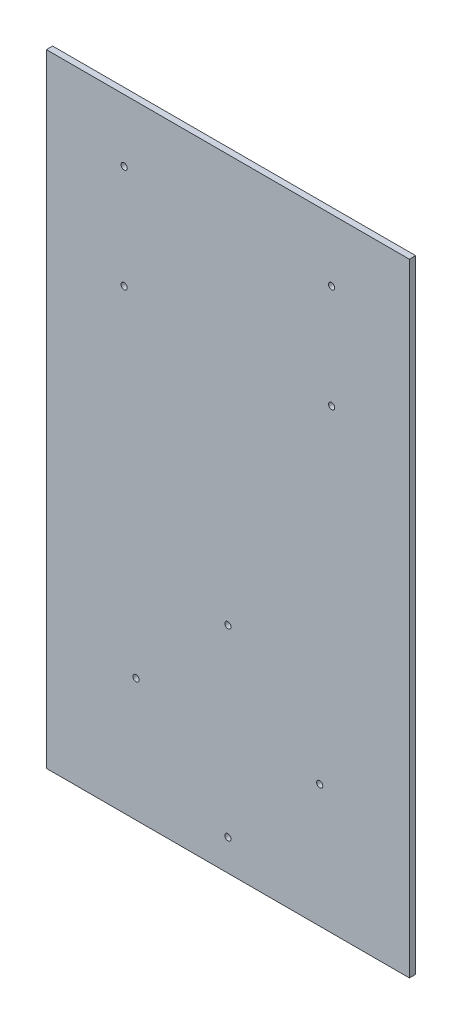
ISO-10303-21;
HEADER;
FILE_DESCRIPTION(('STEP AP214'),'2;1');
FILE_NAME('part.step','',(''),(''),'','','');
FILE_SCHEMA(('AUTOMOTIVE_DESIGN { 1 0 10303 214 1 1 1 1 }'));
ENDSEC;
DATA;
#1=APPLICATION_CONTEXT('core data for automotive mechanical design processes');
#2=APPLICATION_PROTOCOL_DEFINITION('international standard','automotive_design',2000,#1);
#3=PRODUCT_CONTEXT('',#1,'mechanical');
#4=PRODUCT('Part','Part','',(#3));
#5=PRODUCT_RELATED_PRODUCT_CATEGORY('part','',(#4));
#6=PRODUCT_DEFINITION_FORMATION('','',#4);
#7=PRODUCT_DEFINITION_CONTEXT('part definition',#1,'design');
#8=PRODUCT_DEFINITION('design','',#6,#7);
#9=PRODUCT_DEFINITION_SHAPE('','',#8);
#10=(LENGTH_UNIT() NAMED_UNIT(*) SI_UNIT(.MILLI.,.METRE.));
#11=(NAMED_UNIT(*) PLANE_ANGLE_UNIT() SI_UNIT($,.RADIAN.));
#12=(NAMED_UNIT(*) SI_UNIT($,.STERADIAN.) SOLID_ANGLE_UNIT());
#13=UNCERTAINTY_MEASURE_WITH_UNIT(LENGTH_MEASURE(1.E-05),#10,'distance_accuracy_value','');
#14=(GEOMETRIC_REPRESENTATION_CONTEXT(3) GLOBAL_UNCERTAINTY_ASSIGNED_CONTEXT((#13)) GLOBAL_UNIT_ASSIGNED_CONTEXT((#10,
#11,#12)) REPRESENTATION_CONTEXT('',''));
#15=CARTESIAN_POINT('',(0.,0.,0.));
#16=DIRECTION('',(0.,0.,1.));
#17=DIRECTION('',(1.,0.,0.));
#18=AXIS2_PLACEMENT_3D('',#15,#16,#17);
#19=CARTESIAN_POINT('',(87.5,-150.,3.));
#20=DIRECTION('',(-1.,0.,0.));
#21=DIRECTION('',(0.,0.,1.));
#22=AXIS2_PLACEMENT_3D('',#19,#20,#21);
#23=PLANE('',#22);
#24=DIRECTION('',(0.,1.,0.));
#25=VECTOR('',#24,1.);
#26=CARTESIAN_POINT('',(87.5,-150.,0.));
#27=LINE('',#26,#25);
#28=CARTESIAN_POINT('',(87.5,-150.,0.));
#29=VERTEX_POINT('',#28);
#30=CARTESIAN_POINT('',(87.5,150.,0.));
#31=VERTEX_POINT('',#30);
#32=EDGE_CURVE('E106',#29,#31,#27,.T.);
#33=ORIENTED_EDGE('',*,*,#32,.T.);
#34=DIRECTION('',(0.,0.,-1.));
#35=VECTOR('',#34,1.);
#36=CARTESIAN_POINT('',(87.5,150.,3.));
#37=LINE('',#36,#35);
#38=CARTESIAN_POINT('',(87.5,150.,3.));
#39=VERTEX_POINT('',#38);
#40=EDGE_CURVE('E11',#39,#31,#37,.T.);
#41=ORIENTED_EDGE('',*,*,#40,.F.);
#42=DIRECTION('',(0.,1.,0.));
#43=VECTOR('',#42,1.);
#44=CARTESIAN_POINT('',(87.5,-150.,3.));
#45=LINE('',#44,#43);
#46=CARTESIAN_POINT('',(87.5,-150.,3.));
#47=VERTEX_POINT('',#46);
#48=EDGE_CURVE('E90',#47,#39,#45,.T.);
#49=ORIENTED_EDGE('',*,*,#48,.F.);
#50=DIRECTION('',(0.,0.,-1.));
#51=VECTOR('',#50,1.);
#52=CARTESIAN_POINT('',(87.5,-150.,3.));
#53=LINE('',#52,#51);
#54=EDGE_CURVE('E102',#47,#29,#53,.T.);
#55=ORIENTED_EDGE('',*,*,#54,.T.);
#56=EDGE_LOOP('',(#33,#41,#49,#55));
#57=FACE_BOUND('',#56,.T.);
#58=ADVANCED_FACE('F38',(#57),#23,.F.);
#59=CARTESIAN_POINT('',(-87.5,150.,3.));
#60=DIRECTION('',(0.,-1.,0.));
#61=DIRECTION('',(0.,0.,-1.));
#62=AXIS2_PLACEMENT_3D('',#59,#60,#61);
#63=PLANE('',#62);
#64=DIRECTION('',(-1.,0.,0.));
#65=VECTOR('',#64,1.);
#66=CARTESIAN_POINT('',(-87.5,150.,0.));
#67=LINE('',#66,#65);
#68=CARTESIAN_POINT('',(-87.5,150.,0.));
#69=VERTEX_POINT('',#68);
#70=EDGE_CURVE('E95',#31,#69,#67,.T.);
#71=ORIENTED_EDGE('',*,*,#70,.T.);
#72=DIRECTION('',(0.,0.,-1.));
#73=VECTOR('',#72,1.);
#74=CARTESIAN_POINT('',(-87.5,150.,3.));
#75=LINE('',#74,#73);
#76=CARTESIAN_POINT('',(-87.5,150.,3.));
#77=VERTEX_POINT('',#76);
#78=EDGE_CURVE('E47',#77,#69,#75,.T.);
#79=ORIENTED_EDGE('',*,*,#78,.F.);
#80=DIRECTION('',(-1.,0.,0.));
#81=VECTOR('',#80,1.);
#82=CARTESIAN_POINT('',(-87.5,150.,3.));
#83=LINE('',#82,#81);
#84=EDGE_CURVE('E85',#39,#77,#83,.T.);
#85=ORIENTED_EDGE('',*,*,#84,.F.);
#86=ORIENTED_EDGE('',*,*,#40,.T.);
#87=EDGE_LOOP('',(#71,#79,#85,#86));
#88=FACE_BOUND('',#87,.T.);
#89=ADVANCED_FACE('F94',(#88),#63,.F.);
#90=CARTESIAN_POINT('',(-87.5,-150.,3.));
#91=DIRECTION('',(1.,0.,0.));
#92=DIRECTION('',(0.,0.,-1.));
#93=AXIS2_PLACEMENT_3D('',#90,#91,#92);
#94=PLANE('',#93);
#95=DIRECTION('',(0.,-1.,0.));
#96=VECTOR('',#95,1.);
#97=CARTESIAN_POINT('',(-87.5,-150.,0.));
#98=LINE('',#97,#96);
#99=CARTESIAN_POINT('',(-87.5,-150.,0.));
#100=VERTEX_POINT('',#99);
#101=EDGE_CURVE('E72',#69,#100,#98,.T.);
#102=ORIENTED_EDGE('',*,*,#101,.T.);
#103=DIRECTION('',(0.,0.,-1.));
#104=VECTOR('',#103,1.);
#105=CARTESIAN_POINT('',(-87.5,-150.,3.));
#106=LINE('',#105,#104);
#107=CARTESIAN_POINT('',(-87.5,-150.,3.));
#108=VERTEX_POINT('',#107);
#109=EDGE_CURVE('E97',#108,#100,#106,.T.);
#110=ORIENTED_EDGE('',*,*,#109,.F.);
#111=DIRECTION('',(0.,-1.,0.));
#112=VECTOR('',#111,1.);
#113=CARTESIAN_POINT('',(-87.5,-150.,3.));
#114=LINE('',#113,#112);
#115=EDGE_CURVE('E88',#77,#108,#114,.T.);
#116=ORIENTED_EDGE('',*,*,#115,.F.);
#117=ORIENTED_EDGE('',*,*,#78,.T.);
#118=EDGE_LOOP('',(#102,#110,#116,#117));
#119=FACE_BOUND('',#118,.T.);
#120=ADVANCED_FACE('F98',(#119),#94,.F.);
#121=CARTESIAN_POINT('',(-87.5,-150.,3.));
#122=DIRECTION('',(0.,1.,0.));
#123=DIRECTION('',(0.,0.,1.));
#124=AXIS2_PLACEMENT_3D('',#121,#122,#123);
#125=PLANE('',#124);
#126=DIRECTION('',(1.,0.,0.));
#127=VECTOR('',#126,1.);
#128=CARTESIAN_POINT('',(-87.5,-150.,0.));
#129=LINE('',#128,#127);
#130=EDGE_CURVE('E78',#100,#29,#129,.T.);
#131=ORIENTED_EDGE('',*,*,#130,.T.);
#132=ORIENTED_EDGE('',*,*,#54,.F.);
#133=DIRECTION('',(1.,0.,0.));
#134=VECTOR('',#133,1.);
#135=CARTESIAN_POINT('',(-87.5,-150.,3.));
#136=LINE('',#135,#134);
#137=EDGE_CURVE('E55',#108,#47,#136,.T.);
#138=ORIENTED_EDGE('',*,*,#137,.F.);
#139=ORIENTED_EDGE('',*,*,#109,.T.);
#140=EDGE_LOOP('',(#131,#132,#138,#139));
#141=FACE_BOUND('',#140,.T.);
#142=ADVANCED_FACE('F120',(#141),#125,.F.);
#143=CARTESIAN_POINT('',(0.,0.,3.));
#144=DIRECTION('',(0.,0.,-1.));
#145=DIRECTION('',(-1.,0.,0.));
#146=AXIS2_PLACEMENT_3D('',#143,#144,#145);
#147=PLANE('',#146);
#148=CARTESIAN_POINT('',(-50.,70.,3.));
#149=DIRECTION('',(0.,0.,1.));
#150=DIRECTION('',(1.,0.,0.));
#151=AXIS2_PLACEMENT_3D('',#148,#149,#150);
#152=CIRCLE('',#151,1.5);
#153=CARTESIAN_POINT('',(-48.5,70.,3.));
#154=VERTEX_POINT('',#153);
#155=EDGE_CURVE('E167',#154,#154,#152,.T.);
#156=ORIENTED_EDGE('',*,*,#155,.F.);
#157=EDGE_LOOP('',(#156));
#158=FACE_BOUND('',#157,.T.);
#159=CARTESIAN_POINT('',(-50.,120.,3.));
#160=DIRECTION('',(0.,0.,1.));
#161=DIRECTION('',(1.,0.,0.));
#162=AXIS2_PLACEMENT_3D('',#159,#160,#161);
#163=CIRCLE('',#162,1.5);
#164=CARTESIAN_POINT('',(-48.5,120.,3.));
#165=VERTEX_POINT('',#164);
#166=EDGE_CURVE('E175',#165,#165,#163,.T.);
#167=ORIENTED_EDGE('',*,*,#166,.F.);
#168=EDGE_LOOP('',(#167));
#169=FACE_BOUND('',#168,.T.);
#170=CARTESIAN_POINT('',(50.,120.,3.));
#171=DIRECTION('',(0.,0.,1.));
#172=DIRECTION('',(1.,0.,0.));
#173=AXIS2_PLACEMENT_3D('',#170,#171,#172);
#174=CIRCLE('',#173,1.5);
#175=CARTESIAN_POINT('',(51.5,120.,3.));
#176=VERTEX_POINT('',#175);
#177=EDGE_CURVE('E183',#176,#176,#174,.T.);
#178=ORIENTED_EDGE('',*,*,#177,.F.);
#179=EDGE_LOOP('',(#178));
#180=FACE_BOUND('',#179,.T.);
#181=CARTESIAN_POINT('',(50.,70.,3.));
#182=DIRECTION('',(0.,0.,1.));
#183=DIRECTION('',(1.,0.,0.));
#184=AXIS2_PLACEMENT_3D('',#181,#182,#183);
#185=CIRCLE('',#184,1.5);
#186=CARTESIAN_POINT('',(51.5,70.,3.));
#187=VERTEX_POINT('',#186);
#188=EDGE_CURVE('E159',#187,#187,#185,.T.);
#189=ORIENTED_EDGE('',*,*,#188,.F.);
#190=EDGE_LOOP('',(#189));
#191=FACE_BOUND('',#190,.T.);
#192=CARTESIAN_POINT('',(0.,-135.,3.));
#193=DIRECTION('',(0.,0.,1.));
#194=DIRECTION('',(1.,0.,0.));
#195=AXIS2_PLACEMENT_3D('',#192,#193,#194);
#196=CIRCLE('',#195,1.5);
#197=CARTESIAN_POINT('',(1.5,-135.,3.));
#198=VERTEX_POINT('',#197);
#199=EDGE_CURVE('E152',#198,#198,#196,.T.);
#200=ORIENTED_EDGE('',*,*,#199,.F.);
#201=EDGE_LOOP('',(#200));
#202=FACE_BOUND('',#201,.T.);
#203=CARTESIAN_POINT('',(-44.25,-90.7499999999999,3.));
#204=DIRECTION('',(0.,0.,1.));
#205=DIRECTION('',(1.,0.,0.));
#206=AXIS2_PLACEMENT_3D('',#203,#204,#205);
#207=CIRCLE('',#206,1.5);
#208=CARTESIAN_POINT('',(-42.75,-90.7499999999999,3.));
#209=VERTEX_POINT('',#208);
#210=EDGE_CURVE('E144',#209,#209,#207,.T.);
#211=ORIENTED_EDGE('',*,*,#210,.F.);
#212=EDGE_LOOP('',(#211));
#213=FACE_BOUND('',#212,.T.);
#214=CARTESIAN_POINT('',(3.19834222660071E-13,-46.5,3.));
#215=DIRECTION('',(0.,0.,1.));
#216=DIRECTION('',(1.,0.,0.));
#217=AXIS2_PLACEMENT_3D('',#214,#215,#216);
#218=CIRCLE('',#217,1.5);
#219=CARTESIAN_POINT('',(1.50000000000032,-46.5,3.));
#220=VERTEX_POINT('',#219);
#221=EDGE_CURVE('E136',#220,#220,#218,.T.);
#222=ORIENTED_EDGE('',*,*,#221,.F.);
#223=EDGE_LOOP('',(#222));
#224=FACE_BOUND('',#223,.T.);
#225=CARTESIAN_POINT('',(44.25,-90.7500000000005,3.));
#226=DIRECTION('',(0.,0.,1.));
#227=DIRECTION('',(1.,0.,0.));
#228=AXIS2_PLACEMENT_3D('',#225,#226,#227);
#229=CIRCLE('',#228,1.5);
#230=CARTESIAN_POINT('',(45.75,-90.7500000000005,3.));
#231=VERTEX_POINT('',#230);
#232=EDGE_CURVE('E127',#231,#231,#229,.T.);
#233=ORIENTED_EDGE('',*,*,#232,.F.);
#234=EDGE_LOOP('',(#233));
#235=FACE_BOUND('',#234,.T.);
#236=ORIENTED_EDGE('',*,*,#48,.T.);
#237=ORIENTED_EDGE('',*,*,#84,.T.);
#238=ORIENTED_EDGE('',*,*,#115,.T.);
#239=ORIENTED_EDGE('',*,*,#137,.T.);
#240=EDGE_LOOP('',(#236,#237,#238,#239));
#241=FACE_BOUND('',#240,.T.);
#242=ADVANCED_FACE('F86',(#158,#169,#180,#191,#202,#213,#224,#235,#241),#147,.F.);
#243=CARTESIAN_POINT('',(0.,0.,0.));
#244=DIRECTION('',(0.,0.,-1.));
#245=DIRECTION('',(-1.,0.,0.));
#246=AXIS2_PLACEMENT_3D('',#243,#244,#245);
#247=PLANE('',#246);
#248=CARTESIAN_POINT('',(-50.,70.,0.));
#249=DIRECTION('',(0.,0.,1.));
#250=DIRECTION('',(1.,0.,0.));
#251=AXIS2_PLACEMENT_3D('',#248,#249,#250);
#252=CIRCLE('',#251,1.5);
#253=CARTESIAN_POINT('',(-48.5,70.,0.));
#254=VERTEX_POINT('',#253);
#255=EDGE_CURVE('E171',#254,#254,#252,.T.);
#256=ORIENTED_EDGE('',*,*,#255,.T.);
#257=EDGE_LOOP('',(#256));
#258=FACE_BOUND('',#257,.T.);
#259=CARTESIAN_POINT('',(-50.,120.,0.));
#260=DIRECTION('',(0.,0.,1.));
#261=DIRECTION('',(1.,0.,0.));
#262=AXIS2_PLACEMENT_3D('',#259,#260,#261);
#263=CIRCLE('',#262,1.5);
#264=CARTESIAN_POINT('',(-48.5,120.,0.));
#265=VERTEX_POINT('',#264);
#266=EDGE_CURVE('E179',#265,#265,#263,.T.);
#267=ORIENTED_EDGE('',*,*,#266,.T.);
#268=EDGE_LOOP('',(#267));
#269=FACE_BOUND('',#268,.T.);
#270=CARTESIAN_POINT('',(50.,120.,0.));
#271=DIRECTION('',(0.,0.,1.));
#272=DIRECTION('',(1.,0.,0.));
#273=AXIS2_PLACEMENT_3D('',#270,#271,#272);
#274=CIRCLE('',#273,1.5);
#275=CARTESIAN_POINT('',(51.5,120.,0.));
#276=VERTEX_POINT('',#275);
#277=EDGE_CURVE('E163',#276,#276,#274,.T.);
#278=ORIENTED_EDGE('',*,*,#277,.T.);
#279=EDGE_LOOP('',(#278));
#280=FACE_BOUND('',#279,.T.);
#281=CARTESIAN_POINT('',(50.,70.,0.));
#282=DIRECTION('',(0.,0.,1.));
#283=DIRECTION('',(1.,0.,0.));
#284=AXIS2_PLACEMENT_3D('',#281,#282,#283);
#285=CIRCLE('',#284,1.5);
#286=CARTESIAN_POINT('',(51.5,70.,0.));
#287=VERTEX_POINT('',#286);
#288=EDGE_CURVE('E132',#287,#287,#285,.T.);
#289=ORIENTED_EDGE('',*,*,#288,.T.);
#290=EDGE_LOOP('',(#289));
#291=FACE_BOUND('',#290,.T.);
#292=CARTESIAN_POINT('',(0.,-135.,0.));
#293=DIRECTION('',(0.,0.,1.));
#294=DIRECTION('',(1.,0.,0.));
#295=AXIS2_PLACEMENT_3D('',#292,#293,#294);
#296=CIRCLE('',#295,1.5);
#297=CARTESIAN_POINT('',(1.5,-135.,0.));
#298=VERTEX_POINT('',#297);
#299=EDGE_CURVE('E110',#298,#298,#296,.T.);
#300=ORIENTED_EDGE('',*,*,#299,.T.);
#301=EDGE_LOOP('',(#300));
#302=FACE_BOUND('',#301,.T.);
#303=CARTESIAN_POINT('',(-44.25,-90.7499999999999,0.));
#304=DIRECTION('',(0.,0.,1.));
#305=DIRECTION('',(1.,0.,0.));
#306=AXIS2_PLACEMENT_3D('',#303,#304,#305);
#307=CIRCLE('',#306,1.5);
#308=CARTESIAN_POINT('',(-42.75,-90.7499999999999,0.));
#309=VERTEX_POINT('',#308);
#310=EDGE_CURVE('E148',#309,#309,#307,.T.);
#311=ORIENTED_EDGE('',*,*,#310,.T.);
#312=EDGE_LOOP('',(#311));
#313=FACE_BOUND('',#312,.T.);
#314=CARTESIAN_POINT('',(3.19834222660071E-13,-46.5,0.));
#315=DIRECTION('',(0.,0.,1.));
#316=DIRECTION('',(1.,0.,0.));
#317=AXIS2_PLACEMENT_3D('',#314,#315,#316);
#318=CIRCLE('',#317,1.5);
#319=CARTESIAN_POINT('',(1.50000000000032,-46.5,0.));
#320=VERTEX_POINT('',#319);
#321=EDGE_CURVE('E140',#320,#320,#318,.T.);
#322=ORIENTED_EDGE('',*,*,#321,.T.);
#323=EDGE_LOOP('',(#322));
#324=FACE_BOUND('',#323,.T.);
#325=CARTESIAN_POINT('',(44.25,-90.7500000000005,0.));
#326=DIRECTION('',(0.,0.,1.));
#327=DIRECTION('',(1.,0.,0.));
#328=AXIS2_PLACEMENT_3D('',#325,#326,#327);
#329=CIRCLE('',#328,1.5);
#330=CARTESIAN_POINT('',(45.75,-90.7500000000005,0.));
#331=VERTEX_POINT('',#330);
#332=EDGE_CURVE('E131',#331,#331,#329,.T.);
#333=ORIENTED_EDGE('',*,*,#332,.T.);
#334=EDGE_LOOP('',(#333));
#335=FACE_BOUND('',#334,.T.);
#336=ORIENTED_EDGE('',*,*,#32,.F.);
#337=ORIENTED_EDGE('',*,*,#130,.F.);
#338=ORIENTED_EDGE('',*,*,#101,.F.);
#339=ORIENTED_EDGE('',*,*,#70,.F.);
#340=EDGE_LOOP('',(#336,#337,#338,#339));
#341=FACE_BOUND('',#340,.T.);
#342=ADVANCED_FACE('F123',(#258,#269,#280,#291,#302,#313,#324,#335,#341),#247,.T.);
#343=CARTESIAN_POINT('',(44.25,-90.7500000000005,0.));
#344=DIRECTION('',(0.,0.,1.));
#345=DIRECTION('',(1.,0.,0.));
#346=AXIS2_PLACEMENT_3D('',#343,#344,#345);
#347=CYLINDRICAL_SURFACE('',#346,1.5);
#348=ORIENTED_EDGE('',*,*,#332,.F.);
#349=EDGE_LOOP('',(#348));
#350=FACE_BOUND('',#349,.T.);
#351=ORIENTED_EDGE('',*,*,#232,.T.);
#352=EDGE_LOOP('',(#351));
#353=FACE_BOUND('',#352,.T.);
#354=ADVANCED_FACE('F215',(#350,#353),#347,.F.);
#355=CARTESIAN_POINT('',(3.19834222660071E-13,-46.5,0.));
#356=DIRECTION('',(0.,0.,1.));
#357=DIRECTION('',(1.,0.,0.));
#358=AXIS2_PLACEMENT_3D('',#355,#356,#357);
#359=CYLINDRICAL_SURFACE('',#358,1.5);
#360=ORIENTED_EDGE('',*,*,#321,.F.);
#361=EDGE_LOOP('',(#360));
#362=FACE_BOUND('',#361,.T.);
#363=ORIENTED_EDGE('',*,*,#221,.T.);
#364=EDGE_LOOP('',(#363));
#365=FACE_BOUND('',#364,.T.);
#366=ADVANCED_FACE('F217',(#362,#365),#359,.F.);
#367=CARTESIAN_POINT('',(-44.25,-90.7499999999999,0.));
#368=DIRECTION('',(0.,0.,1.));
#369=DIRECTION('',(1.,0.,0.));
#370=AXIS2_PLACEMENT_3D('',#367,#368,#369);
#371=CYLINDRICAL_SURFACE('',#370,1.5);
#372=ORIENTED_EDGE('',*,*,#310,.F.);
#373=EDGE_LOOP('',(#372));
#374=FACE_BOUND('',#373,.T.);
#375=ORIENTED_EDGE('',*,*,#210,.T.);
#376=EDGE_LOOP('',(#375));
#377=FACE_BOUND('',#376,.T.);
#378=ADVANCED_FACE('F224',(#374,#377),#371,.F.);
#379=CARTESIAN_POINT('',(0.,-135.,0.));
#380=DIRECTION('',(0.,0.,1.));
#381=DIRECTION('',(1.,0.,0.));
#382=AXIS2_PLACEMENT_3D('',#379,#380,#381);
#383=CYLINDRICAL_SURFACE('',#382,1.5);
#384=ORIENTED_EDGE('',*,*,#299,.F.);
#385=EDGE_LOOP('',(#384));
#386=FACE_BOUND('',#385,.T.);
#387=ORIENTED_EDGE('',*,*,#199,.T.);
#388=EDGE_LOOP('',(#387));
#389=FACE_BOUND('',#388,.T.);
#390=ADVANCED_FACE('F265',(#386,#389),#383,.F.);
#391=CARTESIAN_POINT('',(50.,70.,0.));
#392=DIRECTION('',(0.,0.,1.));
#393=DIRECTION('',(1.,0.,0.));
#394=AXIS2_PLACEMENT_3D('',#391,#392,#393);
#395=CYLINDRICAL_SURFACE('',#394,1.5);
#396=ORIENTED_EDGE('',*,*,#288,.F.);
#397=EDGE_LOOP('',(#396));
#398=FACE_BOUND('',#397,.T.);
#399=ORIENTED_EDGE('',*,*,#188,.T.);
#400=EDGE_LOOP('',(#399));
#401=FACE_BOUND('',#400,.T.);
#402=ADVANCED_FACE('F197',(#398,#401),#395,.F.);
#403=CARTESIAN_POINT('',(50.,120.,0.));
#404=DIRECTION('',(0.,0.,1.));
#405=DIRECTION('',(1.,0.,0.));
#406=AXIS2_PLACEMENT_3D('',#403,#404,#405);
#407=CYLINDRICAL_SURFACE('',#406,1.5);
#408=ORIENTED_EDGE('',*,*,#277,.F.);
#409=EDGE_LOOP('',(#408));
#410=FACE_BOUND('',#409,.T.);
#411=ORIENTED_EDGE('',*,*,#177,.T.);
#412=EDGE_LOOP('',(#411));
#413=FACE_BOUND('',#412,.T.);
#414=ADVANCED_FACE('F193',(#410,#413),#407,.F.);
#415=CARTESIAN_POINT('',(-50.,120.,0.));
#416=DIRECTION('',(0.,0.,1.));
#417=DIRECTION('',(1.,0.,0.));
#418=AXIS2_PLACEMENT_3D('',#415,#416,#417);
#419=CYLINDRICAL_SURFACE('',#418,1.5);
#420=ORIENTED_EDGE('',*,*,#266,.F.);
#421=EDGE_LOOP('',(#420));
#422=FACE_BOUND('',#421,.T.);
#423=ORIENTED_EDGE('',*,*,#166,.T.);
#424=EDGE_LOOP('',(#423));
#425=FACE_BOUND('',#424,.T.);
#426=ADVANCED_FACE('F196',(#422,#425),#419,.F.);
#427=CARTESIAN_POINT('',(-50.,70.,0.));
#428=DIRECTION('',(0.,0.,1.));
#429=DIRECTION('',(1.,0.,0.));
#430=AXIS2_PLACEMENT_3D('',#427,#428,#429);
#431=CYLINDRICAL_SURFACE('',#430,1.5);
#432=ORIENTED_EDGE('',*,*,#255,.F.);
#433=EDGE_LOOP('',(#432));
#434=FACE_BOUND('',#433,.T.);
#435=ORIENTED_EDGE('',*,*,#155,.T.);
#436=EDGE_LOOP('',(#435));
#437=FACE_BOUND('',#436,.T.);
#438=ADVANCED_FACE('F283',(#434,#437),#431,.F.);
#439=CLOSED_SHELL('',(#58,#89,#120,#142,#242,#342,#354,#366,#378,#390,#402,#414,#426,#438));
#440=MANIFOLD_SOLID_BREP('B2',#439);
#441=ADVANCED_BREP_SHAPE_REPRESENTATION('',(#18,#440),#14);
#442=SHAPE_DEFINITION_REPRESENTATION(#9,#441);
ENDSEC;
END-ISO-10303-21;
